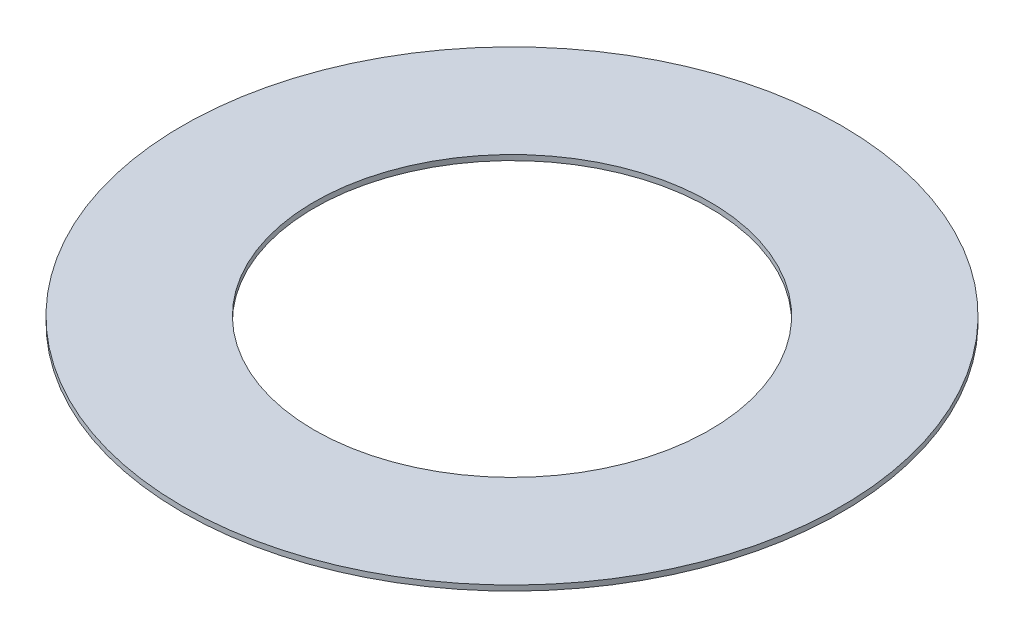
ISO-10303-21;
HEADER;
FILE_DESCRIPTION(('STEP AP214'),'2;1');
FILE_NAME('part.step','',(''),(''),'','','');
FILE_SCHEMA(('AUTOMOTIVE_DESIGN { 1 0 10303 214 1 1 1 1 }'));
ENDSEC;
DATA;
#1=APPLICATION_CONTEXT('core data for automotive mechanical design processes');
#2=APPLICATION_PROTOCOL_DEFINITION('international standard','automotive_design',2000,#1);
#3=PRODUCT_CONTEXT('',#1,'mechanical');
#4=PRODUCT('Part','Part','',(#3));
#5=PRODUCT_RELATED_PRODUCT_CATEGORY('part','',(#4));
#6=PRODUCT_DEFINITION_FORMATION('','',#4);
#7=PRODUCT_DEFINITION_CONTEXT('part definition',#1,'design');
#8=PRODUCT_DEFINITION('design','',#6,#7);
#9=PRODUCT_DEFINITION_SHAPE('','',#8);
#10=(LENGTH_UNIT() NAMED_UNIT(*) SI_UNIT(.MILLI.,.METRE.));
#11=(NAMED_UNIT(*) PLANE_ANGLE_UNIT() SI_UNIT($,.RADIAN.));
#12=(NAMED_UNIT(*) SI_UNIT($,.STERADIAN.) SOLID_ANGLE_UNIT());
#13=UNCERTAINTY_MEASURE_WITH_UNIT(LENGTH_MEASURE(1.E-05),#10,'distance_accuracy_value','');
#14=(GEOMETRIC_REPRESENTATION_CONTEXT(3) GLOBAL_UNCERTAINTY_ASSIGNED_CONTEXT((#13)) GLOBAL_UNIT_ASSIGNED_CONTEXT((#10,
#11,#12)) REPRESENTATION_CONTEXT('',''));
#15=CARTESIAN_POINT('',(0.,0.,0.));
#16=DIRECTION('',(0.,0.,1.));
#17=DIRECTION('',(1.,0.,0.));
#18=AXIS2_PLACEMENT_3D('',#15,#16,#17);
#19=CARTESIAN_POINT('',(0.,0.127,0.));
#20=DIRECTION('',(0.,-1.,0.));
#21=DIRECTION('',(0.,0.,-1.));
#22=AXIS2_PLACEMENT_3D('',#19,#20,#21);
#23=CYLINDRICAL_SURFACE('',#22,7.9375);
#24=CARTESIAN_POINT('',(0.,0.127,0.));
#25=DIRECTION('',(0.,1.,0.));
#26=DIRECTION('',(0.,0.,1.));
#27=AXIS2_PLACEMENT_3D('',#24,#25,#26);
#28=CIRCLE('',#27,7.9375);
#29=CARTESIAN_POINT('',(0.,0.127,7.9375));
#30=VERTEX_POINT('',#29);
#31=EDGE_CURVE('E10',#30,#30,#28,.T.);
#32=ORIENTED_EDGE('',*,*,#31,.F.);
#33=EDGE_LOOP('',(#32));
#34=FACE_BOUND('',#33,.T.);
#35=CARTESIAN_POINT('',(0.,0.,0.));
#36=DIRECTION('',(0.,1.,0.));
#37=DIRECTION('',(0.,0.,1.));
#38=AXIS2_PLACEMENT_3D('',#35,#36,#37);
#39=CIRCLE('',#38,7.9375);
#40=CARTESIAN_POINT('',(0.,0.,7.9375));
#41=VERTEX_POINT('',#40);
#42=EDGE_CURVE('E33',#41,#41,#39,.T.);
#43=ORIENTED_EDGE('',*,*,#42,.T.);
#44=EDGE_LOOP('',(#43));
#45=FACE_BOUND('',#44,.T.);
#46=ADVANCED_FACE('F30',(#34,#45),#23,.T.);
#47=CARTESIAN_POINT('',(0.,0.127,0.));
#48=DIRECTION('',(0.,1.,0.));
#49=DIRECTION('',(0.,0.,1.));
#50=AXIS2_PLACEMENT_3D('',#47,#48,#49);
#51=PLANE('',#50);
#52=CARTESIAN_POINT('',(0.,0.127,0.));
#53=DIRECTION('',(0.,1.,0.));
#54=DIRECTION('',(0.,0.,1.));
#55=AXIS2_PLACEMENT_3D('',#52,#53,#54);
#56=CIRCLE('',#55,4.7625);
#57=CARTESIAN_POINT('',(0.,0.127,4.7625));
#58=VERTEX_POINT('',#57);
#59=EDGE_CURVE('E42',#58,#58,#56,.T.);
#60=ORIENTED_EDGE('',*,*,#59,.F.);
#61=EDGE_LOOP('',(#60));
#62=FACE_BOUND('',#61,.T.);
#63=ORIENTED_EDGE('',*,*,#31,.T.);
#64=EDGE_LOOP('',(#63));
#65=FACE_BOUND('',#64,.T.);
#66=ADVANCED_FACE('F57',(#62,#65),#51,.T.);
#67=CARTESIAN_POINT('',(0.,0.,0.));
#68=DIRECTION('',(0.,1.,0.));
#69=DIRECTION('',(0.,0.,1.));
#70=AXIS2_PLACEMENT_3D('',#67,#68,#69);
#71=PLANE('',#70);
#72=CARTESIAN_POINT('',(0.,0.,0.));
#73=DIRECTION('',(0.,1.,0.));
#74=DIRECTION('',(0.,0.,1.));
#75=AXIS2_PLACEMENT_3D('',#72,#73,#74);
#76=CIRCLE('',#75,4.7625);
#77=CARTESIAN_POINT('',(0.,0.,4.7625));
#78=VERTEX_POINT('',#77);
#79=EDGE_CURVE('E40',#78,#78,#76,.T.);
#80=ORIENTED_EDGE('',*,*,#79,.T.);
#81=EDGE_LOOP('',(#80));
#82=FACE_BOUND('',#81,.T.);
#83=ORIENTED_EDGE('',*,*,#42,.F.);
#84=EDGE_LOOP('',(#83));
#85=FACE_BOUND('',#84,.T.);
#86=ADVANCED_FACE('F48',(#82,#85),#71,.F.);
#87=CARTESIAN_POINT('',(0.,0.,0.));
#88=DIRECTION('',(0.,1.,0.));
#89=DIRECTION('',(0.,0.,1.));
#90=AXIS2_PLACEMENT_3D('',#87,#88,#89);
#91=CYLINDRICAL_SURFACE('',#90,4.7625);
#92=ORIENTED_EDGE('',*,*,#79,.F.);
#93=EDGE_LOOP('',(#92));
#94=FACE_BOUND('',#93,.T.);
#95=ORIENTED_EDGE('',*,*,#59,.T.);
#96=EDGE_LOOP('',(#95));
#97=FACE_BOUND('',#96,.T.);
#98=ADVANCED_FACE('F51',(#94,#97),#91,.F.);
#99=CLOSED_SHELL('',(#46,#66,#86,#98));
#100=MANIFOLD_SOLID_BREP('B2',#99);
#101=ADVANCED_BREP_SHAPE_REPRESENTATION('',(#18,#100),#14);
#102=SHAPE_DEFINITION_REPRESENTATION(#9,#101);
ENDSEC;
END-ISO-10303-21;
